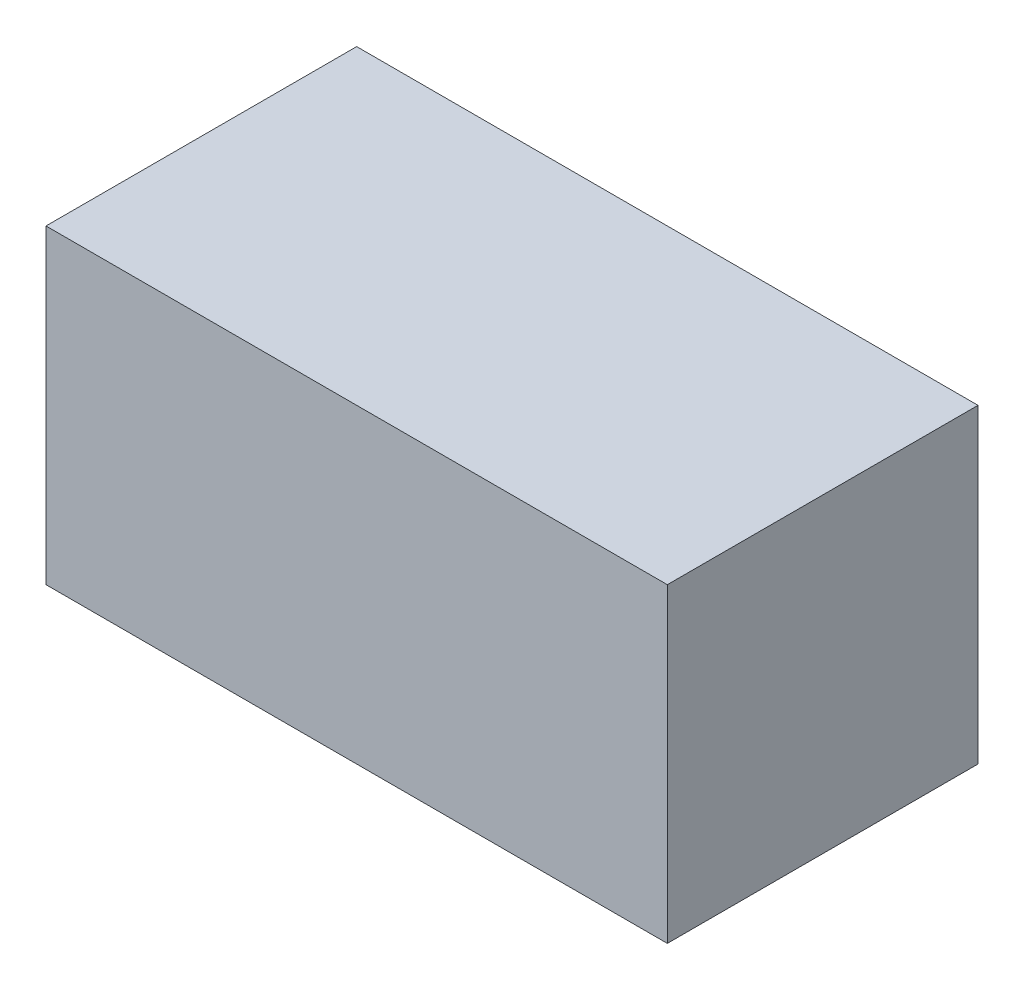
ISO-10303-21;
HEADER;
FILE_DESCRIPTION(('STEP AP214'),'2;1');
FILE_NAME('part.step','',(''),(''),'','','');
FILE_SCHEMA(('AUTOMOTIVE_DESIGN { 1 0 10303 214 1 1 1 1 }'));
ENDSEC;
DATA;
#1=APPLICATION_CONTEXT('core data for automotive mechanical design processes');
#2=APPLICATION_PROTOCOL_DEFINITION('international standard','automotive_design',2000,#1);
#3=PRODUCT_CONTEXT('',#1,'mechanical');
#4=PRODUCT('Part','Part','',(#3));
#5=PRODUCT_RELATED_PRODUCT_CATEGORY('part','',(#4));
#6=PRODUCT_DEFINITION_FORMATION('','',#4);
#7=PRODUCT_DEFINITION_CONTEXT('part definition',#1,'design');
#8=PRODUCT_DEFINITION('design','',#6,#7);
#9=PRODUCT_DEFINITION_SHAPE('','',#8);
#10=(LENGTH_UNIT() NAMED_UNIT(*) SI_UNIT(.MILLI.,.METRE.));
#11=(NAMED_UNIT(*) PLANE_ANGLE_UNIT() SI_UNIT($,.RADIAN.));
#12=(NAMED_UNIT(*) SI_UNIT($,.STERADIAN.) SOLID_ANGLE_UNIT());
#13=UNCERTAINTY_MEASURE_WITH_UNIT(LENGTH_MEASURE(1.E-05),#10,'distance_accuracy_value','');
#14=(GEOMETRIC_REPRESENTATION_CONTEXT(3) GLOBAL_UNCERTAINTY_ASSIGNED_CONTEXT((#13)) GLOBAL_UNIT_ASSIGNED_CONTEXT((#10,
#11,#12)) REPRESENTATION_CONTEXT('',''));
#15=CARTESIAN_POINT('',(0.,0.,0.));
#16=DIRECTION('',(0.,0.,1.));
#17=DIRECTION('',(1.,0.,0.));
#18=AXIS2_PLACEMENT_3D('',#15,#16,#17);
#19=CARTESIAN_POINT('',(0.,0.,4.));
#20=DIRECTION('',(1.,0.,0.));
#21=DIRECTION('',(0.,0.,-1.));
#22=AXIS2_PLACEMENT_3D('',#19,#20,#21);
#23=PLANE('',#22);
#24=DIRECTION('',(0.,-1.,0.));
#25=VECTOR('',#24,1.);
#26=CARTESIAN_POINT('',(0.,0.,0.));
#27=LINE('',#26,#25);
#28=CARTESIAN_POINT('',(0.,4.,0.));
#29=VERTEX_POINT('',#28);
#30=CARTESIAN_POINT('',(0.,0.,0.));
#31=VERTEX_POINT('',#30);
#32=EDGE_CURVE('E76',#29,#31,#27,.T.);
#33=ORIENTED_EDGE('',*,*,#32,.T.);
#34=DIRECTION('',(0.,0.,-1.));
#35=VECTOR('',#34,1.);
#36=CARTESIAN_POINT('',(0.,0.,4.));
#37=LINE('',#36,#35);
#38=CARTESIAN_POINT('',(0.,0.,4.));
#39=VERTEX_POINT('',#38);
#40=EDGE_CURVE('E11',#39,#31,#37,.T.);
#41=ORIENTED_EDGE('',*,*,#40,.F.);
#42=DIRECTION('',(0.,-1.,0.));
#43=VECTOR('',#42,1.);
#44=CARTESIAN_POINT('',(0.,0.,4.));
#45=LINE('',#44,#43);
#46=CARTESIAN_POINT('',(0.,4.,4.));
#47=VERTEX_POINT('',#46);
#48=EDGE_CURVE('E94',#47,#39,#45,.T.);
#49=ORIENTED_EDGE('',*,*,#48,.F.);
#50=DIRECTION('',(0.,0.,-1.));
#51=VECTOR('',#50,1.);
#52=CARTESIAN_POINT('',(0.,4.,4.));
#53=LINE('',#52,#51);
#54=EDGE_CURVE('E88',#47,#29,#53,.T.);
#55=ORIENTED_EDGE('',*,*,#54,.T.);
#56=EDGE_LOOP('',(#33,#41,#49,#55));
#57=FACE_BOUND('',#56,.T.);
#58=ADVANCED_FACE('F32',(#57),#23,.F.);
#59=CARTESIAN_POINT('',(0.,0.,4.));
#60=DIRECTION('',(0.,1.,0.));
#61=DIRECTION('',(0.,0.,1.));
#62=AXIS2_PLACEMENT_3D('',#59,#60,#61);
#63=PLANE('',#62);
#64=DIRECTION('',(1.,0.,0.));
#65=VECTOR('',#64,1.);
#66=CARTESIAN_POINT('',(0.,0.,0.));
#67=LINE('',#66,#65);
#68=CARTESIAN_POINT('',(8.,0.,0.));
#69=VERTEX_POINT('',#68);
#70=EDGE_CURVE('E72',#31,#69,#67,.T.);
#71=ORIENTED_EDGE('',*,*,#70,.T.);
#72=DIRECTION('',(0.,0.,-1.));
#73=VECTOR('',#72,1.);
#74=CARTESIAN_POINT('',(8.,0.,4.));
#75=LINE('',#74,#73);
#76=CARTESIAN_POINT('',(8.,0.,4.));
#77=VERTEX_POINT('',#76);
#78=EDGE_CURVE('E39',#77,#69,#75,.T.);
#79=ORIENTED_EDGE('',*,*,#78,.F.);
#80=DIRECTION('',(1.,0.,0.));
#81=VECTOR('',#80,1.);
#82=CARTESIAN_POINT('',(0.,0.,4.));
#83=LINE('',#82,#81);
#84=EDGE_CURVE('E84',#39,#77,#83,.T.);
#85=ORIENTED_EDGE('',*,*,#84,.F.);
#86=ORIENTED_EDGE('',*,*,#40,.T.);
#87=EDGE_LOOP('',(#71,#79,#85,#86));
#88=FACE_BOUND('',#87,.T.);
#89=ADVANCED_FACE('F83',(#88),#63,.F.);
#90=CARTESIAN_POINT('',(8.,0.,4.));
#91=DIRECTION('',(-1.,0.,0.));
#92=DIRECTION('',(0.,0.,1.));
#93=AXIS2_PLACEMENT_3D('',#90,#91,#92);
#94=PLANE('',#93);
#95=DIRECTION('',(0.,1.,0.));
#96=VECTOR('',#95,1.);
#97=CARTESIAN_POINT('',(8.,0.,0.));
#98=LINE('',#97,#96);
#99=CARTESIAN_POINT('',(8.,4.,0.));
#100=VERTEX_POINT('',#99);
#101=EDGE_CURVE('E77',#69,#100,#98,.T.);
#102=ORIENTED_EDGE('',*,*,#101,.T.);
#103=DIRECTION('',(0.,0.,-1.));
#104=VECTOR('',#103,1.);
#105=CARTESIAN_POINT('',(8.,4.,4.));
#106=LINE('',#105,#104);
#107=CARTESIAN_POINT('',(8.,4.,4.));
#108=VERTEX_POINT('',#107);
#109=EDGE_CURVE('E100',#108,#100,#106,.T.);
#110=ORIENTED_EDGE('',*,*,#109,.F.);
#111=DIRECTION('',(0.,1.,0.));
#112=VECTOR('',#111,1.);
#113=CARTESIAN_POINT('',(8.,0.,4.));
#114=LINE('',#113,#112);
#115=EDGE_CURVE('E51',#77,#108,#114,.T.);
#116=ORIENTED_EDGE('',*,*,#115,.F.);
#117=ORIENTED_EDGE('',*,*,#78,.T.);
#118=EDGE_LOOP('',(#102,#110,#116,#117));
#119=FACE_BOUND('',#118,.T.);
#120=ADVANCED_FACE('F103',(#119),#94,.F.);
#121=CARTESIAN_POINT('',(0.,4.,4.));
#122=DIRECTION('',(0.,-1.,0.));
#123=DIRECTION('',(0.,0.,-1.));
#124=AXIS2_PLACEMENT_3D('',#121,#122,#123);
#125=PLANE('',#124);
#126=DIRECTION('',(-1.,0.,0.));
#127=VECTOR('',#126,1.);
#128=CARTESIAN_POINT('',(0.,4.,0.));
#129=LINE('',#128,#127);
#130=EDGE_CURVE('E92',#100,#29,#129,.T.);
#131=ORIENTED_EDGE('',*,*,#130,.T.);
#132=ORIENTED_EDGE('',*,*,#54,.F.);
#133=DIRECTION('',(-1.,0.,0.));
#134=VECTOR('',#133,1.);
#135=CARTESIAN_POINT('',(0.,4.,4.));
#136=LINE('',#135,#134);
#137=EDGE_CURVE('E46',#108,#47,#136,.T.);
#138=ORIENTED_EDGE('',*,*,#137,.F.);
#139=ORIENTED_EDGE('',*,*,#109,.T.);
#140=EDGE_LOOP('',(#131,#132,#138,#139));
#141=FACE_BOUND('',#140,.T.);
#142=ADVANCED_FACE('F105',(#141),#125,.F.);
#143=CARTESIAN_POINT('',(0.,4.,4.));
#144=DIRECTION('',(0.,0.,-1.));
#145=DIRECTION('',(-1.,0.,0.));
#146=AXIS2_PLACEMENT_3D('',#143,#144,#145);
#147=PLANE('',#146);
#148=ORIENTED_EDGE('',*,*,#48,.T.);
#149=ORIENTED_EDGE('',*,*,#84,.T.);
#150=ORIENTED_EDGE('',*,*,#115,.T.);
#151=ORIENTED_EDGE('',*,*,#137,.T.);
#152=EDGE_LOOP('',(#148,#149,#150,#151));
#153=FACE_BOUND('',#152,.T.);
#154=ADVANCED_FACE('F106',(#153),#147,.F.);
#155=CARTESIAN_POINT('',(0.,4.,0.));
#156=DIRECTION('',(0.,0.,-1.));
#157=DIRECTION('',(-1.,0.,0.));
#158=AXIS2_PLACEMENT_3D('',#155,#156,#157);
#159=PLANE('',#158);
#160=ORIENTED_EDGE('',*,*,#32,.F.);
#161=ORIENTED_EDGE('',*,*,#130,.F.);
#162=ORIENTED_EDGE('',*,*,#101,.F.);
#163=ORIENTED_EDGE('',*,*,#70,.F.);
#164=EDGE_LOOP('',(#160,#161,#162,#163));
#165=FACE_BOUND('',#164,.T.);
#166=ADVANCED_FACE('F73',(#165),#159,.T.);
#167=CLOSED_SHELL('',(#58,#89,#120,#142,#154,#166));
#168=MANIFOLD_SOLID_BREP('B2',#167);
#169=ADVANCED_BREP_SHAPE_REPRESENTATION('',(#18,#168),#14);
#170=SHAPE_DEFINITION_REPRESENTATION(#9,#169);
ENDSEC;
END-ISO-10303-21;
